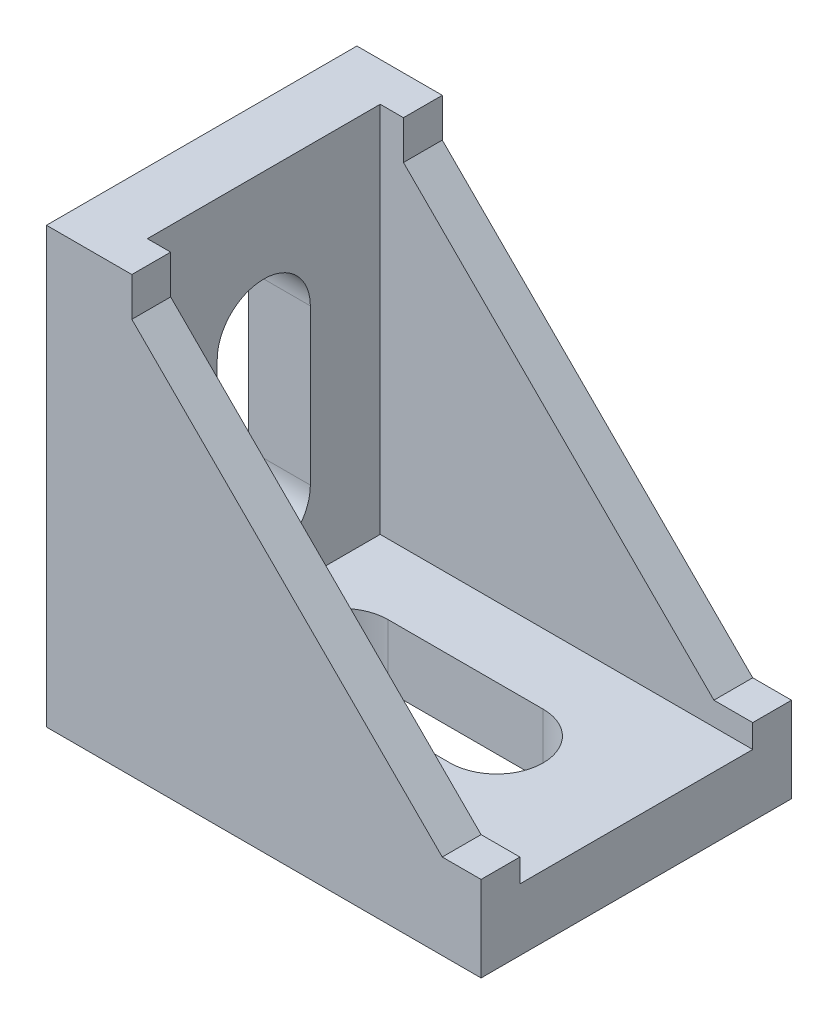
ISO-10303-21;
HEADER;
FILE_DESCRIPTION(('STEP AP214'),'2;1');
FILE_NAME('part.step','',(''),(''),'','','');
FILE_SCHEMA(('AUTOMOTIVE_DESIGN { 1 0 10303 214 1 1 1 1 }'));
ENDSEC;
DATA;
#1=APPLICATION_CONTEXT('core data for automotive mechanical design processes');
#2=APPLICATION_PROTOCOL_DEFINITION('international standard','automotive_design',2000,#1);
#3=PRODUCT_CONTEXT('',#1,'mechanical');
#4=PRODUCT('Part','Part','',(#3));
#5=PRODUCT_RELATED_PRODUCT_CATEGORY('part','',(#4));
#6=PRODUCT_DEFINITION_FORMATION('','',#4);
#7=PRODUCT_DEFINITION_CONTEXT('part definition',#1,'design');
#8=PRODUCT_DEFINITION('design','',#6,#7);
#9=PRODUCT_DEFINITION_SHAPE('','',#8);
#10=(LENGTH_UNIT() NAMED_UNIT(*) SI_UNIT(.MILLI.,.METRE.));
#11=(NAMED_UNIT(*) PLANE_ANGLE_UNIT() SI_UNIT($,.RADIAN.));
#12=(NAMED_UNIT(*) SI_UNIT($,.STERADIAN.) SOLID_ANGLE_UNIT());
#13=UNCERTAINTY_MEASURE_WITH_UNIT(LENGTH_MEASURE(1.E-05),#10,'distance_accuracy_value','');
#14=(GEOMETRIC_REPRESENTATION_CONTEXT(3) GLOBAL_UNCERTAINTY_ASSIGNED_CONTEXT((#13)) GLOBAL_UNIT_ASSIGNED_CONTEXT((#10,
#11,#12)) REPRESENTATION_CONTEXT('',''));
#15=CARTESIAN_POINT('',(0.,0.,0.));
#16=DIRECTION('',(0.,0.,1.));
#17=DIRECTION('',(1.,0.,0.));
#18=AXIS2_PLACEMENT_3D('',#15,#16,#17);
#19=CARTESIAN_POINT('',(0.,0.,20.));
#20=DIRECTION('',(0.,1.,0.));
#21=DIRECTION('',(0.,0.,1.));
#22=AXIS2_PLACEMENT_3D('',#19,#20,#21);
#23=PLANE('',#22);
#24=DIRECTION('',(1.,0.,0.));
#25=VECTOR('',#24,1.);
#26=CARTESIAN_POINT('',(0.,0.,0.));
#27=LINE('',#26,#25);
#28=CARTESIAN_POINT('',(0.,0.,0.));
#29=VERTEX_POINT('',#28);
#30=CARTESIAN_POINT('',(28.,0.,0.));
#31=VERTEX_POINT('',#30);
#32=EDGE_CURVE('E430',#29,#31,#27,.T.);
#33=ORIENTED_EDGE('',*,*,#32,.T.);
#34=DIRECTION('',(0.,0.,-1.));
#35=VECTOR('',#34,1.);
#36=CARTESIAN_POINT('',(28.,0.,20.));
#37=LINE('',#36,#35);
#38=CARTESIAN_POINT('',(28.,0.,20.));
#39=VERTEX_POINT('',#38);
#40=EDGE_CURVE('E438',#39,#31,#37,.T.);
#41=ORIENTED_EDGE('',*,*,#40,.F.);
#42=DIRECTION('',(1.,0.,0.));
#43=VECTOR('',#42,1.);
#44=CARTESIAN_POINT('',(0.,0.,20.));
#45=LINE('',#44,#43);
#46=CARTESIAN_POINT('',(0.,0.,20.));
#47=VERTEX_POINT('',#46);
#48=EDGE_CURVE('E419',#47,#39,#45,.T.);
#49=ORIENTED_EDGE('',*,*,#48,.F.);
#50=DIRECTION('',(0.,0.,-1.));
#51=VECTOR('',#50,1.);
#52=CARTESIAN_POINT('',(0.,0.,20.));
#53=LINE('',#52,#51);
#54=EDGE_CURVE('E441',#47,#29,#53,.T.);
#55=ORIENTED_EDGE('',*,*,#54,.T.);
#56=EDGE_LOOP('',(#33,#41,#49,#55));
#57=FACE_BOUND('',#56,.T.);
#58=DIRECTION('',(-1.,0.,0.));
#59=VECTOR('',#58,1.);
#60=CARTESIAN_POINT('',(19.,0.,13.));
#61=LINE('',#60,#59);
#62=CARTESIAN_POINT('',(19.,0.,13.));
#63=VERTEX_POINT('',#62);
#64=CARTESIAN_POINT('',(9.,0.,13.));
#65=VERTEX_POINT('',#64);
#66=EDGE_CURVE('E293',#63,#65,#61,.T.);
#67=ORIENTED_EDGE('',*,*,#66,.F.);
#68=CARTESIAN_POINT('',(19.,0.,10.));
#69=DIRECTION('',(0.,1.,0.));
#70=DIRECTION('',(0.,0.,1.));
#71=AXIS2_PLACEMENT_3D('',#68,#69,#70);
#72=CIRCLE('',#71,3.);
#73=CARTESIAN_POINT('',(19.,0.,7.));
#74=VERTEX_POINT('',#73);
#75=EDGE_CURVE('E296',#74,#63,#72,.F.);
#76=ORIENTED_EDGE('',*,*,#75,.F.);
#77=DIRECTION('',(1.,0.,0.));
#78=VECTOR('',#77,1.);
#79=CARTESIAN_POINT('',(9.,0.,7.));
#80=LINE('',#79,#78);
#81=CARTESIAN_POINT('',(9.,0.,7.));
#82=VERTEX_POINT('',#81);
#83=EDGE_CURVE('E298',#82,#74,#80,.T.);
#84=ORIENTED_EDGE('',*,*,#83,.F.);
#85=CARTESIAN_POINT('',(9.,0.,10.));
#86=DIRECTION('',(0.,1.,0.));
#87=DIRECTION('',(0.,0.,1.));
#88=AXIS2_PLACEMENT_3D('',#85,#86,#87);
#89=CIRCLE('',#88,3.);
#90=EDGE_CURVE('E290',#65,#82,#89,.F.);
#91=ORIENTED_EDGE('',*,*,#90,.F.);
#92=EDGE_LOOP('',(#67,#76,#84,#91));
#93=FACE_BOUND('',#92,.T.);
#94=DIRECTION('',(-1.,0.,0.));
#95=VECTOR('',#94,1.);
#96=CARTESIAN_POINT('',(27.,0.,12.9));
#97=LINE('',#96,#95);
#98=CARTESIAN_POINT('',(27.,0.,12.9));
#99=VERTEX_POINT('',#98);
#100=CARTESIAN_POINT('',(26.,0.,12.9));
#101=VERTEX_POINT('',#100);
#102=EDGE_CURVE('E250',#99,#101,#97,.T.);
#103=ORIENTED_EDGE('',*,*,#102,.F.);
#104=DIRECTION('',(0.,0.,1.));
#105=VECTOR('',#104,1.);
#106=CARTESIAN_POINT('',(27.,0.,12.9));
#107=LINE('',#106,#105);
#108=CARTESIAN_POINT('',(27.,0.,7.1));
#109=VERTEX_POINT('',#108);
#110=EDGE_CURVE('E247',#109,#99,#107,.T.);
#111=ORIENTED_EDGE('',*,*,#110,.F.);
#112=DIRECTION('',(1.,0.,0.));
#113=VECTOR('',#112,1.);
#114=CARTESIAN_POINT('',(27.,0.,7.1));
#115=LINE('',#114,#113);
#116=CARTESIAN_POINT('',(26.,0.,7.1));
#117=VERTEX_POINT('',#116);
#118=EDGE_CURVE('E54',#117,#109,#115,.T.);
#119=ORIENTED_EDGE('',*,*,#118,.F.);
#120=DIRECTION('',(0.,0.,-1.));
#121=VECTOR('',#120,1.);
#122=CARTESIAN_POINT('',(26.,0.,12.9));
#123=LINE('',#122,#121);
#124=EDGE_CURVE('E49',#101,#117,#123,.T.);
#125=ORIENTED_EDGE('',*,*,#124,.F.);
#126=EDGE_LOOP('',(#103,#111,#119,#125));
#127=FACE_BOUND('',#126,.T.);
#128=ADVANCED_FACE('F34',(#57,#93,#127),#23,.F.);
#129=CARTESIAN_POINT('',(0.,0.,20.));
#130=DIRECTION('',(1.,0.,0.));
#131=DIRECTION('',(0.,0.,-1.));
#132=AXIS2_PLACEMENT_3D('',#129,#130,#131);
#133=PLANE('',#132);
#134=DIRECTION('',(0.,-1.,0.));
#135=VECTOR('',#134,1.);
#136=CARTESIAN_POINT('',(0.,0.,0.));
#137=LINE('',#136,#135);
#138=CARTESIAN_POINT('',(0.,28.,0.));
#139=VERTEX_POINT('',#138);
#140=EDGE_CURVE('E415',#139,#29,#137,.T.);
#141=ORIENTED_EDGE('',*,*,#140,.T.);
#142=ORIENTED_EDGE('',*,*,#54,.F.);
#143=DIRECTION('',(0.,-1.,0.));
#144=VECTOR('',#143,1.);
#145=CARTESIAN_POINT('',(0.,0.,20.));
#146=LINE('',#145,#144);
#147=CARTESIAN_POINT('',(0.,28.,20.));
#148=VERTEX_POINT('',#147);
#149=EDGE_CURVE('E416',#148,#47,#146,.T.);
#150=ORIENTED_EDGE('',*,*,#149,.F.);
#151=DIRECTION('',(0.,0.,-1.));
#152=VECTOR('',#151,1.);
#153=CARTESIAN_POINT('',(0.,28.,20.));
#154=LINE('',#153,#152);
#155=EDGE_CURVE('E427',#148,#139,#154,.T.);
#156=ORIENTED_EDGE('',*,*,#155,.T.);
#157=EDGE_LOOP('',(#141,#142,#150,#156));
#158=FACE_BOUND('',#157,.T.);
#159=DIRECTION('',(0.,-1.,0.));
#160=VECTOR('',#159,1.);
#161=CARTESIAN_POINT('',(0.,19.,7.));
#162=LINE('',#161,#160);
#163=CARTESIAN_POINT('',(0.,19.,7.));
#164=VERTEX_POINT('',#163);
#165=CARTESIAN_POINT('',(0.,9.,7.));
#166=VERTEX_POINT('',#165);
#167=EDGE_CURVE('E322',#164,#166,#162,.T.);
#168=ORIENTED_EDGE('',*,*,#167,.F.);
#169=CARTESIAN_POINT('',(0.,19.,10.));
#170=DIRECTION('',(1.,0.,0.));
#171=DIRECTION('',(0.,0.,-1.));
#172=AXIS2_PLACEMENT_3D('',#169,#170,#171);
#173=CIRCLE('',#172,3.);
#174=CARTESIAN_POINT('',(0.,19.,13.));
#175=VERTEX_POINT('',#174);
#176=EDGE_CURVE('E325',#175,#164,#173,.F.);
#177=ORIENTED_EDGE('',*,*,#176,.F.);
#178=DIRECTION('',(0.,1.,0.));
#179=VECTOR('',#178,1.);
#180=CARTESIAN_POINT('',(0.,19.,13.));
#181=LINE('',#180,#179);
#182=CARTESIAN_POINT('',(0.,9.,13.));
#183=VERTEX_POINT('',#182);
#184=EDGE_CURVE('E327',#183,#175,#181,.T.);
#185=ORIENTED_EDGE('',*,*,#184,.F.);
#186=CARTESIAN_POINT('',(0.,9.,10.));
#187=DIRECTION('',(1.,0.,0.));
#188=DIRECTION('',(0.,0.,-1.));
#189=AXIS2_PLACEMENT_3D('',#186,#187,#188);
#190=CIRCLE('',#189,3.);
#191=EDGE_CURVE('E319',#166,#183,#190,.F.);
#192=ORIENTED_EDGE('',*,*,#191,.F.);
#193=EDGE_LOOP('',(#168,#177,#185,#192));
#194=FACE_BOUND('',#193,.T.);
#195=DIRECTION('',(0.,-1.,0.));
#196=VECTOR('',#195,1.);
#197=CARTESIAN_POINT('',(0.,27.,7.1));
#198=LINE('',#197,#196);
#199=CARTESIAN_POINT('',(0.,27.,7.1));
#200=VERTEX_POINT('',#199);
#201=CARTESIAN_POINT('',(0.,26.,7.1));
#202=VERTEX_POINT('',#201);
#203=EDGE_CURVE('E251',#200,#202,#198,.T.);
#204=ORIENTED_EDGE('',*,*,#203,.F.);
#205=DIRECTION('',(0.,0.,-1.));
#206=VECTOR('',#205,1.);
#207=CARTESIAN_POINT('',(0.,27.,12.9));
#208=LINE('',#207,#206);
#209=CARTESIAN_POINT('',(0.,27.,12.9));
#210=VERTEX_POINT('',#209);
#211=EDGE_CURVE('E264',#210,#200,#208,.T.);
#212=ORIENTED_EDGE('',*,*,#211,.F.);
#213=DIRECTION('',(0.,1.,0.));
#214=VECTOR('',#213,1.);
#215=CARTESIAN_POINT('',(0.,27.,12.9));
#216=LINE('',#215,#214);
#217=CARTESIAN_POINT('',(0.,26.,12.9));
#218=VERTEX_POINT('',#217);
#219=EDGE_CURVE('E273',#218,#210,#216,.T.);
#220=ORIENTED_EDGE('',*,*,#219,.F.);
#221=DIRECTION('',(0.,0.,1.));
#222=VECTOR('',#221,1.);
#223=CARTESIAN_POINT('',(0.,26.,12.9));
#224=LINE('',#223,#222);
#225=EDGE_CURVE('E254',#202,#218,#224,.T.);
#226=ORIENTED_EDGE('',*,*,#225,.F.);
#227=EDGE_LOOP('',(#204,#212,#220,#226));
#228=FACE_BOUND('',#227,.T.);
#229=ADVANCED_FACE('F36',(#158,#194,#228),#133,.F.);
#230=CARTESIAN_POINT('',(5.5,29.4261426220374,0.));
#231=DIRECTION('',(-1.,0.,0.));
#232=DIRECTION('',(0.,0.,1.));
#233=AXIS2_PLACEMENT_3D('',#230,#231,#232);
#234=PLANE('',#233);
#235=DIRECTION('',(0.,0.,1.));
#236=VECTOR('',#235,1.);
#237=CARTESIAN_POINT('',(5.5,25.5,0.));
#238=LINE('',#237,#236);
#239=CARTESIAN_POINT('',(5.5,25.5,17.5));
#240=VERTEX_POINT('',#239);
#241=CARTESIAN_POINT('',(5.5,25.5,20.));
#242=VERTEX_POINT('',#241);
#243=EDGE_CURVE('E404',#240,#242,#238,.T.);
#244=ORIENTED_EDGE('',*,*,#243,.F.);
#245=DIRECTION('',(0.,1.,0.));
#246=VECTOR('',#245,1.);
#247=CARTESIAN_POINT('',(5.5,29.4261426220374,17.5));
#248=LINE('',#247,#246);
#249=CARTESIAN_POINT('',(5.5,28.,17.5));
#250=VERTEX_POINT('',#249);
#251=EDGE_CURVE('E378',#240,#250,#248,.T.);
#252=ORIENTED_EDGE('',*,*,#251,.T.);
#253=DIRECTION('',(0.,0.,-1.));
#254=VECTOR('',#253,1.);
#255=CARTESIAN_POINT('',(5.5,28.,20.));
#256=LINE('',#255,#254);
#257=CARTESIAN_POINT('',(5.5,28.,20.));
#258=VERTEX_POINT('',#257);
#259=EDGE_CURVE('E412',#258,#250,#256,.T.);
#260=ORIENTED_EDGE('',*,*,#259,.F.);
#261=DIRECTION('',(0.,-1.,0.));
#262=VECTOR('',#261,1.);
#263=CARTESIAN_POINT('',(5.5,29.4261426220374,20.));
#264=LINE('',#263,#262);
#265=EDGE_CURVE('E389',#258,#242,#264,.T.);
#266=ORIENTED_EDGE('',*,*,#265,.T.);
#267=EDGE_LOOP('',(#244,#252,#260,#266));
#268=FACE_BOUND('',#267,.T.);
#269=ADVANCED_FACE('F456',(#268),#234,.F.);
#270=CARTESIAN_POINT('',(25.5,5.5,0.));
#271=DIRECTION('',(0.,-1.,0.));
#272=DIRECTION('',(1.,0.,0.));
#273=AXIS2_PLACEMENT_3D('',#270,#271,#272);
#274=PLANE('',#273);
#275=DIRECTION('',(0.,0.,1.));
#276=VECTOR('',#275,1.);
#277=CARTESIAN_POINT('',(28.,5.5,20.));
#278=LINE('',#277,#276);
#279=CARTESIAN_POINT('',(28.,5.5,17.5));
#280=VERTEX_POINT('',#279);
#281=CARTESIAN_POINT('',(28.,5.5,20.));
#282=VERTEX_POINT('',#281);
#283=EDGE_CURVE('E403',#280,#282,#278,.T.);
#284=ORIENTED_EDGE('',*,*,#283,.F.);
#285=DIRECTION('',(-1.,0.,0.));
#286=VECTOR('',#285,1.);
#287=CARTESIAN_POINT('',(25.5,5.5,17.5));
#288=LINE('',#287,#286);
#289=CARTESIAN_POINT('',(25.5,5.5,17.5));
#290=VERTEX_POINT('',#289);
#291=EDGE_CURVE('E375',#280,#290,#288,.T.);
#292=ORIENTED_EDGE('',*,*,#291,.T.);
#293=DIRECTION('',(0.,0.,1.));
#294=VECTOR('',#293,1.);
#295=CARTESIAN_POINT('',(25.5,5.5,0.));
#296=LINE('',#295,#294);
#297=CARTESIAN_POINT('',(25.5,5.5,20.));
#298=VERTEX_POINT('',#297);
#299=EDGE_CURVE('E392',#290,#298,#296,.T.);
#300=ORIENTED_EDGE('',*,*,#299,.T.);
#301=DIRECTION('',(1.,0.,0.));
#302=VECTOR('',#301,1.);
#303=CARTESIAN_POINT('',(25.5,5.5,20.));
#304=LINE('',#303,#302);
#305=EDGE_CURVE('E395',#298,#282,#304,.T.);
#306=ORIENTED_EDGE('',*,*,#305,.T.);
#307=EDGE_LOOP('',(#284,#292,#300,#306));
#308=FACE_BOUND('',#307,.T.);
#309=ADVANCED_FACE('F466',(#308),#274,.F.);
#310=CARTESIAN_POINT('',(5.5,25.5,0.));
#311=DIRECTION('',(-0.707106781186548,-0.707106781186548,0.));
#312=DIRECTION('',(0.707106781186548,-0.707106781186548,0.));
#313=AXIS2_PLACEMENT_3D('',#310,#311,#312);
#314=PLANE('',#313);
#315=ORIENTED_EDGE('',*,*,#299,.F.);
#316=DIRECTION('',(-0.707106781186548,0.707106781186548,0.));
#317=VECTOR('',#316,1.);
#318=CARTESIAN_POINT('',(5.5,25.5,17.5));
#319=LINE('',#318,#317);
#320=EDGE_CURVE('E42',#290,#240,#319,.T.);
#321=ORIENTED_EDGE('',*,*,#320,.T.);
#322=ORIENTED_EDGE('',*,*,#243,.T.);
#323=DIRECTION('',(0.707106781186548,-0.707106781186548,0.));
#324=VECTOR('',#323,1.);
#325=CARTESIAN_POINT('',(5.5,25.5,20.));
#326=LINE('',#325,#324);
#327=EDGE_CURVE('E384',#242,#298,#326,.T.);
#328=ORIENTED_EDGE('',*,*,#327,.T.);
#329=EDGE_LOOP('',(#315,#321,#322,#328));
#330=FACE_BOUND('',#329,.T.);
#331=ADVANCED_FACE('F453',(#330),#314,.F.);
#332=CARTESIAN_POINT('',(28.,0.,20.));
#333=DIRECTION('',(-1.,0.,0.));
#334=DIRECTION('',(0.,0.,1.));
#335=AXIS2_PLACEMENT_3D('',#332,#333,#334);
#336=PLANE('',#335);
#337=DIRECTION('',(0.,0.,-1.));
#338=VECTOR('',#337,1.);
#339=CARTESIAN_POINT('',(28.,4.,17.5));
#340=LINE('',#339,#338);
#341=CARTESIAN_POINT('',(28.,4.,17.5));
#342=VERTEX_POINT('',#341);
#343=CARTESIAN_POINT('',(28.,4.,2.5));
#344=VERTEX_POINT('',#343);
#345=EDGE_CURVE('E350',#342,#344,#340,.T.);
#346=ORIENTED_EDGE('',*,*,#345,.F.);
#347=DIRECTION('',(0.,-1.,0.));
#348=VECTOR('',#347,1.);
#349=CARTESIAN_POINT('',(28.,30.8809496041156,17.5));
#350=LINE('',#349,#348);
#351=EDGE_CURVE('E353',#280,#342,#350,.T.);
#352=ORIENTED_EDGE('',*,*,#351,.F.);
#353=ORIENTED_EDGE('',*,*,#283,.T.);
#354=DIRECTION('',(0.,1.,0.));
#355=VECTOR('',#354,1.);
#356=CARTESIAN_POINT('',(28.,0.,20.));
#357=LINE('',#356,#355);
#358=EDGE_CURVE('E422',#39,#282,#357,.T.);
#359=ORIENTED_EDGE('',*,*,#358,.F.);
#360=ORIENTED_EDGE('',*,*,#40,.T.);
#361=DIRECTION('',(0.,1.,0.));
#362=VECTOR('',#361,1.);
#363=CARTESIAN_POINT('',(28.,0.,0.));
#364=LINE('',#363,#362);
#365=CARTESIAN_POINT('',(28.,5.5,0.));
#366=VERTEX_POINT('',#365);
#367=EDGE_CURVE('E432',#31,#366,#364,.T.);
#368=ORIENTED_EDGE('',*,*,#367,.T.);
#369=CARTESIAN_POINT('',(28.,5.5,2.5));
#370=VERTEX_POINT('',#369);
#371=EDGE_CURVE('E408',#366,#370,#278,.T.);
#372=ORIENTED_EDGE('',*,*,#371,.T.);
#373=DIRECTION('',(0.,1.,0.));
#374=VECTOR('',#373,1.);
#375=CARTESIAN_POINT('',(28.,30.8809496041156,2.5));
#376=LINE('',#375,#374);
#377=EDGE_CURVE('E348',#344,#370,#376,.T.);
#378=ORIENTED_EDGE('',*,*,#377,.F.);
#379=EDGE_LOOP('',(#346,#352,#353,#359,#360,#368,#372,#378));
#380=FACE_BOUND('',#379,.T.);
#381=ADVANCED_FACE('F472',(#380),#336,.F.);
#382=CARTESIAN_POINT('',(0.,28.,20.));
#383=DIRECTION('',(0.,-1.,0.));
#384=DIRECTION('',(0.,0.,-1.));
#385=AXIS2_PLACEMENT_3D('',#382,#383,#384);
#386=PLANE('',#385);
#387=ORIENTED_EDGE('',*,*,#259,.T.);
#388=DIRECTION('',(-1.,0.,0.));
#389=VECTOR('',#388,1.);
#390=CARTESIAN_POINT('',(0.,28.,17.5));
#391=LINE('',#390,#389);
#392=CARTESIAN_POINT('',(4.,28.,17.5));
#393=VERTEX_POINT('',#392);
#394=EDGE_CURVE('E381',#250,#393,#391,.T.);
#395=ORIENTED_EDGE('',*,*,#394,.T.);
#396=DIRECTION('',(0.,0.,1.));
#397=VECTOR('',#396,1.);
#398=CARTESIAN_POINT('',(4.,28.,20.));
#399=LINE('',#398,#397);
#400=CARTESIAN_POINT('',(4.,28.,2.5));
#401=VERTEX_POINT('',#400);
#402=EDGE_CURVE('E11',#401,#393,#399,.T.);
#403=ORIENTED_EDGE('',*,*,#402,.F.);
#404=DIRECTION('',(1.,0.,0.));
#405=VECTOR('',#404,1.);
#406=CARTESIAN_POINT('',(0.,28.,2.5));
#407=LINE('',#406,#405);
#408=CARTESIAN_POINT('',(5.5,28.,2.5));
#409=VERTEX_POINT('',#408);
#410=EDGE_CURVE('E372',#401,#409,#407,.T.);
#411=ORIENTED_EDGE('',*,*,#410,.T.);
#412=CARTESIAN_POINT('',(5.5,28.,0.));
#413=VERTEX_POINT('',#412);
#414=EDGE_CURVE('E411',#409,#413,#256,.T.);
#415=ORIENTED_EDGE('',*,*,#414,.T.);
#416=DIRECTION('',(-1.,0.,0.));
#417=VECTOR('',#416,1.);
#418=CARTESIAN_POINT('',(0.,28.,0.));
#419=LINE('',#418,#417);
#420=EDGE_CURVE('E420',#413,#139,#419,.T.);
#421=ORIENTED_EDGE('',*,*,#420,.T.);
#422=ORIENTED_EDGE('',*,*,#155,.F.);
#423=DIRECTION('',(-1.,0.,0.));
#424=VECTOR('',#423,1.);
#425=CARTESIAN_POINT('',(0.,28.,20.));
#426=LINE('',#425,#424);
#427=EDGE_CURVE('E425',#258,#148,#426,.T.);
#428=ORIENTED_EDGE('',*,*,#427,.F.);
#429=EDGE_LOOP('',(#387,#395,#403,#411,#415,#421,#422,#428));
#430=FACE_BOUND('',#429,.T.);
#431=ADVANCED_FACE('F486',(#430),#386,.F.);
#432=CARTESIAN_POINT('',(0.,0.,20.));
#433=DIRECTION('',(0.,0.,-1.));
#434=DIRECTION('',(-1.,0.,0.));
#435=AXIS2_PLACEMENT_3D('',#432,#433,#434);
#436=PLANE('',#435);
#437=ORIENTED_EDGE('',*,*,#327,.F.);
#438=ORIENTED_EDGE('',*,*,#265,.F.);
#439=ORIENTED_EDGE('',*,*,#427,.T.);
#440=ORIENTED_EDGE('',*,*,#149,.T.);
#441=ORIENTED_EDGE('',*,*,#48,.T.);
#442=ORIENTED_EDGE('',*,*,#358,.T.);
#443=ORIENTED_EDGE('',*,*,#305,.F.);
#444=EDGE_LOOP('',(#437,#438,#439,#440,#441,#442,#443));
#445=FACE_BOUND('',#444,.T.);
#446=ADVANCED_FACE('F462',(#445),#436,.F.);
#447=CARTESIAN_POINT('',(0.,0.,0.));
#448=DIRECTION('',(0.,0.,-1.));
#449=DIRECTION('',(-1.,0.,0.));
#450=AXIS2_PLACEMENT_3D('',#447,#448,#449);
#451=PLANE('',#450);
#452=DIRECTION('',(0.,1.,0.));
#453=VECTOR('',#452,1.);
#454=CARTESIAN_POINT('',(5.5,0.,0.));
#455=LINE('',#454,#453);
#456=CARTESIAN_POINT('',(5.5,25.5,0.));
#457=VERTEX_POINT('',#456);
#458=EDGE_CURVE('E444',#457,#413,#455,.T.);
#459=ORIENTED_EDGE('',*,*,#458,.F.);
#460=DIRECTION('',(0.707106781186548,-0.707106781186548,0.));
#461=VECTOR('',#460,1.);
#462=CARTESIAN_POINT('',(5.5,25.5,0.));
#463=LINE('',#462,#461);
#464=CARTESIAN_POINT('',(25.5,5.5,0.));
#465=VERTEX_POINT('',#464);
#466=EDGE_CURVE('E385',#457,#465,#463,.T.);
#467=ORIENTED_EDGE('',*,*,#466,.T.);
#468=DIRECTION('',(1.,0.,0.));
#469=VECTOR('',#468,1.);
#470=CARTESIAN_POINT('',(25.5,5.5,0.));
#471=LINE('',#470,#469);
#472=EDGE_CURVE('E388',#465,#366,#471,.T.);
#473=ORIENTED_EDGE('',*,*,#472,.T.);
#474=ORIENTED_EDGE('',*,*,#367,.F.);
#475=ORIENTED_EDGE('',*,*,#32,.F.);
#476=ORIENTED_EDGE('',*,*,#140,.F.);
#477=ORIENTED_EDGE('',*,*,#420,.F.);
#478=EDGE_LOOP('',(#459,#467,#473,#474,#475,#476,#477));
#479=FACE_BOUND('',#478,.T.);
#480=ADVANCED_FACE('F500',(#479),#451,.T.);
#481=ORIENTED_EDGE('',*,*,#414,.F.);
#482=DIRECTION('',(0.,-1.,0.));
#483=VECTOR('',#482,1.);
#484=CARTESIAN_POINT('',(5.5,29.4261426220374,2.5));
#485=LINE('',#484,#483);
#486=CARTESIAN_POINT('',(5.5,25.5,2.5));
#487=VERTEX_POINT('',#486);
#488=EDGE_CURVE('E369',#409,#487,#485,.T.);
#489=ORIENTED_EDGE('',*,*,#488,.T.);
#490=EDGE_CURVE('E400',#457,#487,#238,.T.);
#491=ORIENTED_EDGE('',*,*,#490,.F.);
#492=ORIENTED_EDGE('',*,*,#458,.T.);
#493=EDGE_LOOP('',(#481,#489,#491,#492));
#494=FACE_BOUND('',#493,.T.);
#495=ADVANCED_FACE('F508',(#494),#234,.F.);
#496=CARTESIAN_POINT('',(25.5,5.5,2.5));
#497=VERTEX_POINT('',#496);
#498=EDGE_CURVE('E405',#465,#497,#296,.T.);
#499=ORIENTED_EDGE('',*,*,#498,.T.);
#500=DIRECTION('',(1.,0.,0.));
#501=VECTOR('',#500,1.);
#502=CARTESIAN_POINT('',(25.5,5.5,2.5));
#503=LINE('',#502,#501);
#504=EDGE_CURVE('E355',#497,#370,#503,.T.);
#505=ORIENTED_EDGE('',*,*,#504,.T.);
#506=ORIENTED_EDGE('',*,*,#371,.F.);
#507=ORIENTED_EDGE('',*,*,#472,.F.);
#508=EDGE_LOOP('',(#499,#505,#506,#507));
#509=FACE_BOUND('',#508,.T.);
#510=ADVANCED_FACE('F504',(#509),#274,.F.);
#511=ORIENTED_EDGE('',*,*,#490,.T.);
#512=DIRECTION('',(0.707106781186548,-0.707106781186548,0.));
#513=VECTOR('',#512,1.);
#514=CARTESIAN_POINT('',(5.5,25.5,2.5));
#515=LINE('',#514,#513);
#516=EDGE_CURVE('E447',#487,#497,#515,.T.);
#517=ORIENTED_EDGE('',*,*,#516,.T.);
#518=ORIENTED_EDGE('',*,*,#498,.F.);
#519=ORIENTED_EDGE('',*,*,#466,.F.);
#520=EDGE_LOOP('',(#511,#517,#518,#519));
#521=FACE_BOUND('',#520,.T.);
#522=ADVANCED_FACE('F506',(#521),#314,.F.);
#523=CARTESIAN_POINT('',(4.,0.,0.));
#524=DIRECTION('',(1.,0.,0.));
#525=DIRECTION('',(0.,0.,-1.));
#526=AXIS2_PLACEMENT_3D('',#523,#524,#525);
#527=PLANE('',#526);
#528=CARTESIAN_POINT('',(4.,19.,10.));
#529=DIRECTION('',(1.,0.,0.));
#530=DIRECTION('',(0.,0.,-1.));
#531=AXIS2_PLACEMENT_3D('',#528,#529,#530);
#532=CIRCLE('',#531,3.);
#533=CARTESIAN_POINT('',(4.,19.,7.));
#534=VERTEX_POINT('',#533);
#535=CARTESIAN_POINT('',(4.,19.,13.));
#536=VERTEX_POINT('',#535);
#537=EDGE_CURVE('E318',#534,#536,#532,.T.);
#538=ORIENTED_EDGE('',*,*,#537,.F.);
#539=DIRECTION('',(0.,1.,0.));
#540=VECTOR('',#539,1.);
#541=CARTESIAN_POINT('',(4.,19.,7.));
#542=LINE('',#541,#540);
#543=CARTESIAN_POINT('',(4.,9.,7.));
#544=VERTEX_POINT('',#543);
#545=EDGE_CURVE('E335',#544,#534,#542,.T.);
#546=ORIENTED_EDGE('',*,*,#545,.F.);
#547=CARTESIAN_POINT('',(4.,9.,10.));
#548=DIRECTION('',(1.,0.,0.));
#549=DIRECTION('',(0.,0.,-1.));
#550=AXIS2_PLACEMENT_3D('',#547,#548,#549);
#551=CIRCLE('',#550,3.);
#552=CARTESIAN_POINT('',(4.,9.,13.));
#553=VERTEX_POINT('',#552);
#554=EDGE_CURVE('E332',#553,#544,#551,.T.);
#555=ORIENTED_EDGE('',*,*,#554,.F.);
#556=DIRECTION('',(0.,-1.,0.));
#557=VECTOR('',#556,1.);
#558=CARTESIAN_POINT('',(4.,19.,13.));
#559=LINE('',#558,#557);
#560=EDGE_CURVE('E329',#536,#553,#559,.T.);
#561=ORIENTED_EDGE('',*,*,#560,.F.);
#562=EDGE_LOOP('',(#538,#546,#555,#561));
#563=FACE_BOUND('',#562,.T.);
#564=ORIENTED_EDGE('',*,*,#402,.T.);
#565=DIRECTION('',(0.,1.,0.));
#566=VECTOR('',#565,1.);
#567=CARTESIAN_POINT('',(4.,30.8809496041156,17.5));
#568=LINE('',#567,#566);
#569=CARTESIAN_POINT('',(4.,4.,17.5));
#570=VERTEX_POINT('',#569);
#571=EDGE_CURVE('E347',#570,#393,#568,.T.);
#572=ORIENTED_EDGE('',*,*,#571,.F.);
#573=DIRECTION('',(0.,0.,1.));
#574=VECTOR('',#573,1.);
#575=CARTESIAN_POINT('',(4.,4.,17.5));
#576=LINE('',#575,#574);
#577=CARTESIAN_POINT('',(4.,4.,2.5));
#578=VERTEX_POINT('',#577);
#579=EDGE_CURVE('E360',#578,#570,#576,.T.);
#580=ORIENTED_EDGE('',*,*,#579,.F.);
#581=DIRECTION('',(0.,-1.,0.));
#582=VECTOR('',#581,1.);
#583=CARTESIAN_POINT('',(4.,30.8809496041156,2.5));
#584=LINE('',#583,#582);
#585=EDGE_CURVE('E358',#401,#578,#584,.T.);
#586=ORIENTED_EDGE('',*,*,#585,.F.);
#587=EDGE_LOOP('',(#564,#572,#580,#586));
#588=FACE_BOUND('',#587,.T.);
#589=ADVANCED_FACE('F483',(#563,#588),#527,.T.);
#590=CARTESIAN_POINT('',(58.782875947822,30.8809496041156,17.5));
#591=DIRECTION('',(0.,0.,1.));
#592=DIRECTION('',(1.,0.,0.));
#593=AXIS2_PLACEMENT_3D('',#590,#591,#592);
#594=PLANE('',#593);
#595=ORIENTED_EDGE('',*,*,#251,.F.);
#596=ORIENTED_EDGE('',*,*,#320,.F.);
#597=ORIENTED_EDGE('',*,*,#291,.F.);
#598=ORIENTED_EDGE('',*,*,#351,.T.);
#599=DIRECTION('',(-1.,0.,0.));
#600=VECTOR('',#599,1.);
#601=CARTESIAN_POINT('',(58.782875947822,4.,17.5));
#602=LINE('',#601,#600);
#603=EDGE_CURVE('E351',#342,#570,#602,.T.);
#604=ORIENTED_EDGE('',*,*,#603,.T.);
#605=ORIENTED_EDGE('',*,*,#571,.T.);
#606=ORIENTED_EDGE('',*,*,#394,.F.);
#607=EDGE_LOOP('',(#595,#596,#597,#598,#604,#605,#606));
#608=FACE_BOUND('',#607,.T.);
#609=ADVANCED_FACE('F468',(#608),#594,.F.);
#610=CARTESIAN_POINT('',(58.782875947822,30.8809496041156,2.5));
#611=DIRECTION('',(0.,0.,-1.));
#612=DIRECTION('',(-1.,0.,0.));
#613=AXIS2_PLACEMENT_3D('',#610,#611,#612);
#614=PLANE('',#613);
#615=ORIENTED_EDGE('',*,*,#585,.T.);
#616=DIRECTION('',(-1.,0.,0.));
#617=VECTOR('',#616,1.);
#618=CARTESIAN_POINT('',(58.782875947822,4.,2.5));
#619=LINE('',#618,#617);
#620=EDGE_CURVE('E363',#344,#578,#619,.T.);
#621=ORIENTED_EDGE('',*,*,#620,.F.);
#622=ORIENTED_EDGE('',*,*,#377,.T.);
#623=ORIENTED_EDGE('',*,*,#504,.F.);
#624=ORIENTED_EDGE('',*,*,#516,.F.);
#625=ORIENTED_EDGE('',*,*,#488,.F.);
#626=ORIENTED_EDGE('',*,*,#410,.F.);
#627=EDGE_LOOP('',(#615,#621,#622,#623,#624,#625,#626));
#628=FACE_BOUND('',#627,.T.);
#629=ADVANCED_FACE('F479',(#628),#614,.F.);
#630=CARTESIAN_POINT('',(58.782875947822,4.,17.5));
#631=DIRECTION('',(0.,-1.,0.));
#632=DIRECTION('',(0.,0.,-1.));
#633=AXIS2_PLACEMENT_3D('',#630,#631,#632);
#634=PLANE('',#633);
#635=DIRECTION('',(-1.,0.,0.));
#636=VECTOR('',#635,1.);
#637=CARTESIAN_POINT('',(9.,4.,7.));
#638=LINE('',#637,#636);
#639=CARTESIAN_POINT('',(19.,4.,7.));
#640=VERTEX_POINT('',#639);
#641=CARTESIAN_POINT('',(9.,4.,7.));
#642=VERTEX_POINT('',#641);
#643=EDGE_CURVE('E300',#640,#642,#638,.T.);
#644=ORIENTED_EDGE('',*,*,#643,.F.);
#645=CARTESIAN_POINT('',(19.,4.,10.));
#646=DIRECTION('',(0.,1.,0.));
#647=DIRECTION('',(0.,0.,1.));
#648=AXIS2_PLACEMENT_3D('',#645,#646,#647);
#649=CIRCLE('',#648,3.);
#650=CARTESIAN_POINT('',(19.,4.,13.));
#651=VERTEX_POINT('',#650);
#652=EDGE_CURVE('E289',#651,#640,#649,.T.);
#653=ORIENTED_EDGE('',*,*,#652,.F.);
#654=DIRECTION('',(1.,0.,0.));
#655=VECTOR('',#654,1.);
#656=CARTESIAN_POINT('',(19.,4.,13.));
#657=LINE('',#656,#655);
#658=CARTESIAN_POINT('',(9.,4.,13.));
#659=VERTEX_POINT('',#658);
#660=EDGE_CURVE('E306',#659,#651,#657,.T.);
#661=ORIENTED_EDGE('',*,*,#660,.F.);
#662=CARTESIAN_POINT('',(9.,4.,10.));
#663=DIRECTION('',(0.,1.,0.));
#664=DIRECTION('',(0.,0.,1.));
#665=AXIS2_PLACEMENT_3D('',#662,#663,#664);
#666=CIRCLE('',#665,3.);
#667=EDGE_CURVE('E303',#642,#659,#666,.T.);
#668=ORIENTED_EDGE('',*,*,#667,.F.);
#669=EDGE_LOOP('',(#644,#653,#661,#668));
#670=FACE_BOUND('',#669,.T.);
#671=ORIENTED_EDGE('',*,*,#345,.T.);
#672=ORIENTED_EDGE('',*,*,#620,.T.);
#673=ORIENTED_EDGE('',*,*,#579,.T.);
#674=ORIENTED_EDGE('',*,*,#603,.F.);
#675=EDGE_LOOP('',(#671,#672,#673,#674));
#676=FACE_BOUND('',#675,.T.);
#677=ADVANCED_FACE('F476',(#670,#676),#634,.F.);
#678=CARTESIAN_POINT('',(-17.0880074906351,19.,10.));
#679=DIRECTION('',(1.,0.,0.));
#680=DIRECTION('',(0.,0.,-1.));
#681=AXIS2_PLACEMENT_3D('',#678,#679,#680);
#682=CYLINDRICAL_SURFACE('',#681,3.);
#683=ORIENTED_EDGE('',*,*,#176,.T.);
#684=DIRECTION('',(1.,0.,0.));
#685=VECTOR('',#684,1.);
#686=CARTESIAN_POINT('',(-17.0880074906351,19.,7.));
#687=LINE('',#686,#685);
#688=EDGE_CURVE('E323',#164,#534,#687,.T.);
#689=ORIENTED_EDGE('',*,*,#688,.T.);
#690=ORIENTED_EDGE('',*,*,#537,.T.);
#691=DIRECTION('',(1.,0.,0.));
#692=VECTOR('',#691,1.);
#693=CARTESIAN_POINT('',(-17.0880074906351,19.,13.));
#694=LINE('',#693,#692);
#695=EDGE_CURVE('E338',#175,#536,#694,.T.);
#696=ORIENTED_EDGE('',*,*,#695,.F.);
#697=EDGE_LOOP('',(#683,#689,#690,#696));
#698=FACE_BOUND('',#697,.T.);
#699=ADVANCED_FACE('F680',(#698),#682,.F.);
#700=CARTESIAN_POINT('',(-17.0880074906351,19.,7.));
#701=DIRECTION('',(0.,0.,-1.));
#702=DIRECTION('',(0.,1.,0.));
#703=AXIS2_PLACEMENT_3D('',#700,#701,#702);
#704=PLANE('',#703);
#705=ORIENTED_EDGE('',*,*,#167,.T.);
#706=DIRECTION('',(1.,0.,0.));
#707=VECTOR('',#706,1.);
#708=CARTESIAN_POINT('',(-17.0880074906351,9.,7.));
#709=LINE('',#708,#707);
#710=EDGE_CURVE('E340',#166,#544,#709,.T.);
#711=ORIENTED_EDGE('',*,*,#710,.T.);
#712=ORIENTED_EDGE('',*,*,#545,.T.);
#713=ORIENTED_EDGE('',*,*,#688,.F.);
#714=EDGE_LOOP('',(#705,#711,#712,#713));
#715=FACE_BOUND('',#714,.T.);
#716=ADVANCED_FACE('F676',(#715),#704,.F.);
#717=CARTESIAN_POINT('',(-17.0880074906351,9.,10.));
#718=DIRECTION('',(1.,0.,0.));
#719=DIRECTION('',(0.,0.,-1.));
#720=AXIS2_PLACEMENT_3D('',#717,#718,#719);
#721=CYLINDRICAL_SURFACE('',#720,3.);
#722=ORIENTED_EDGE('',*,*,#191,.T.);
#723=DIRECTION('',(1.,0.,0.));
#724=VECTOR('',#723,1.);
#725=CARTESIAN_POINT('',(-17.0880074906351,9.,13.));
#726=LINE('',#725,#724);
#727=EDGE_CURVE('E342',#183,#553,#726,.T.);
#728=ORIENTED_EDGE('',*,*,#727,.T.);
#729=ORIENTED_EDGE('',*,*,#554,.T.);
#730=ORIENTED_EDGE('',*,*,#710,.F.);
#731=EDGE_LOOP('',(#722,#728,#729,#730));
#732=FACE_BOUND('',#731,.T.);
#733=ADVANCED_FACE('F679',(#732),#721,.F.);
#734=CARTESIAN_POINT('',(-17.0880074906351,19.,13.));
#735=DIRECTION('',(0.,0.,1.));
#736=DIRECTION('',(1.,0.,0.));
#737=AXIS2_PLACEMENT_3D('',#734,#735,#736);
#738=PLANE('',#737);
#739=ORIENTED_EDGE('',*,*,#184,.T.);
#740=ORIENTED_EDGE('',*,*,#695,.T.);
#741=ORIENTED_EDGE('',*,*,#560,.T.);
#742=ORIENTED_EDGE('',*,*,#727,.F.);
#743=EDGE_LOOP('',(#739,#740,#741,#742));
#744=FACE_BOUND('',#743,.T.);
#745=ADVANCED_FACE('F674',(#744),#738,.F.);
#746=CARTESIAN_POINT('',(19.,-17.0880074906351,10.));
#747=DIRECTION('',(0.,1.,0.));
#748=DIRECTION('',(0.,0.,1.));
#749=AXIS2_PLACEMENT_3D('',#746,#747,#748);
#750=CYLINDRICAL_SURFACE('',#749,3.);
#751=ORIENTED_EDGE('',*,*,#75,.T.);
#752=DIRECTION('',(0.,1.,0.));
#753=VECTOR('',#752,1.);
#754=CARTESIAN_POINT('',(19.,-17.0880074906351,13.));
#755=LINE('',#754,#753);
#756=EDGE_CURVE('E294',#63,#651,#755,.T.);
#757=ORIENTED_EDGE('',*,*,#756,.T.);
#758=ORIENTED_EDGE('',*,*,#652,.T.);
#759=DIRECTION('',(0.,1.,0.));
#760=VECTOR('',#759,1.);
#761=CARTESIAN_POINT('',(19.,-17.0880074906351,7.));
#762=LINE('',#761,#760);
#763=EDGE_CURVE('E309',#74,#640,#762,.T.);
#764=ORIENTED_EDGE('',*,*,#763,.F.);
#765=EDGE_LOOP('',(#751,#757,#758,#764));
#766=FACE_BOUND('',#765,.T.);
#767=ADVANCED_FACE('F665',(#766),#750,.F.);
#768=CARTESIAN_POINT('',(19.,-17.0880074906351,13.));
#769=DIRECTION('',(0.,0.,1.));
#770=DIRECTION('',(1.,0.,0.));
#771=AXIS2_PLACEMENT_3D('',#768,#769,#770);
#772=PLANE('',#771);
#773=ORIENTED_EDGE('',*,*,#66,.T.);
#774=DIRECTION('',(0.,1.,0.));
#775=VECTOR('',#774,1.);
#776=CARTESIAN_POINT('',(9.,-17.0880074906351,13.));
#777=LINE('',#776,#775);
#778=EDGE_CURVE('E311',#65,#659,#777,.T.);
#779=ORIENTED_EDGE('',*,*,#778,.T.);
#780=ORIENTED_EDGE('',*,*,#660,.T.);
#781=ORIENTED_EDGE('',*,*,#756,.F.);
#782=EDGE_LOOP('',(#773,#779,#780,#781));
#783=FACE_BOUND('',#782,.T.);
#784=ADVANCED_FACE('F661',(#783),#772,.F.);
#785=CARTESIAN_POINT('',(9.,-17.0880074906351,10.));
#786=DIRECTION('',(0.,1.,0.));
#787=DIRECTION('',(0.,0.,1.));
#788=AXIS2_PLACEMENT_3D('',#785,#786,#787);
#789=CYLINDRICAL_SURFACE('',#788,3.);
#790=ORIENTED_EDGE('',*,*,#90,.T.);
#791=DIRECTION('',(0.,1.,0.));
#792=VECTOR('',#791,1.);
#793=CARTESIAN_POINT('',(9.,-17.0880074906351,7.));
#794=LINE('',#793,#792);
#795=EDGE_CURVE('E313',#82,#642,#794,.T.);
#796=ORIENTED_EDGE('',*,*,#795,.T.);
#797=ORIENTED_EDGE('',*,*,#667,.T.);
#798=ORIENTED_EDGE('',*,*,#778,.F.);
#799=EDGE_LOOP('',(#790,#796,#797,#798));
#800=FACE_BOUND('',#799,.T.);
#801=ADVANCED_FACE('F664',(#800),#789,.F.);
#802=CARTESIAN_POINT('',(9.,-17.0880074906351,7.));
#803=DIRECTION('',(0.,0.,-1.));
#804=DIRECTION('',(-1.,0.,0.));
#805=AXIS2_PLACEMENT_3D('',#802,#803,#804);
#806=PLANE('',#805);
#807=ORIENTED_EDGE('',*,*,#83,.T.);
#808=ORIENTED_EDGE('',*,*,#763,.T.);
#809=ORIENTED_EDGE('',*,*,#643,.T.);
#810=ORIENTED_EDGE('',*,*,#795,.F.);
#811=EDGE_LOOP('',(#807,#808,#809,#810));
#812=FACE_BOUND('',#811,.T.);
#813=ADVANCED_FACE('F560',(#812),#806,.F.);
#814=CARTESIAN_POINT('',(-1.,27.,7.1));
#815=DIRECTION('',(0.,0.,1.));
#816=DIRECTION('',(1.,0.,0.));
#817=AXIS2_PLACEMENT_3D('',#814,#815,#816);
#818=PLANE('',#817);
#819=ORIENTED_EDGE('',*,*,#203,.T.);
#820=DIRECTION('',(1.,0.,0.));
#821=VECTOR('',#820,1.);
#822=CARTESIAN_POINT('',(-1.,26.,7.1));
#823=LINE('',#822,#821);
#824=CARTESIAN_POINT('',(-1.,26.,7.1));
#825=VERTEX_POINT('',#824);
#826=EDGE_CURVE('E286',#825,#202,#823,.T.);
#827=ORIENTED_EDGE('',*,*,#826,.F.);
#828=DIRECTION('',(0.,-1.,0.));
#829=VECTOR('',#828,1.);
#830=CARTESIAN_POINT('',(-1.,27.,7.1));
#831=LINE('',#830,#829);
#832=CARTESIAN_POINT('',(-1.,27.,7.1));
#833=VERTEX_POINT('',#832);
#834=EDGE_CURVE('E260',#833,#825,#831,.T.);
#835=ORIENTED_EDGE('',*,*,#834,.F.);
#836=DIRECTION('',(1.,0.,0.));
#837=VECTOR('',#836,1.);
#838=CARTESIAN_POINT('',(-1.,27.,7.1));
#839=LINE('',#838,#837);
#840=EDGE_CURVE('E269',#833,#200,#839,.T.);
#841=ORIENTED_EDGE('',*,*,#840,.T.);
#842=EDGE_LOOP('',(#819,#827,#835,#841));
#843=FACE_BOUND('',#842,.T.);
#844=ADVANCED_FACE('F564',(#843),#818,.F.);
#845=CARTESIAN_POINT('',(-1.,26.,12.9));
#846=DIRECTION('',(0.,1.,0.));
#847=DIRECTION('',(0.,0.,1.));
#848=AXIS2_PLACEMENT_3D('',#845,#846,#847);
#849=PLANE('',#848);
#850=ORIENTED_EDGE('',*,*,#225,.T.);
#851=DIRECTION('',(1.,0.,0.));
#852=VECTOR('',#851,1.);
#853=CARTESIAN_POINT('',(-1.,26.,12.9));
#854=LINE('',#853,#852);
#855=CARTESIAN_POINT('',(-1.,26.,12.9));
#856=VERTEX_POINT('',#855);
#857=EDGE_CURVE('E283',#856,#218,#854,.T.);
#858=ORIENTED_EDGE('',*,*,#857,.F.);
#859=DIRECTION('',(0.,0.,1.));
#860=VECTOR('',#859,1.);
#861=CARTESIAN_POINT('',(-1.,26.,12.9));
#862=LINE('',#861,#860);
#863=EDGE_CURVE('E263',#825,#856,#862,.T.);
#864=ORIENTED_EDGE('',*,*,#863,.F.);
#865=ORIENTED_EDGE('',*,*,#826,.T.);
#866=EDGE_LOOP('',(#850,#858,#864,#865));
#867=FACE_BOUND('',#866,.T.);
#868=ADVANCED_FACE('F568',(#867),#849,.F.);
#869=CARTESIAN_POINT('',(-1.,27.,12.9));
#870=DIRECTION('',(0.,0.,-1.));
#871=DIRECTION('',(-1.,0.,0.));
#872=AXIS2_PLACEMENT_3D('',#869,#870,#871);
#873=PLANE('',#872);
#874=ORIENTED_EDGE('',*,*,#219,.T.);
#875=DIRECTION('',(1.,0.,0.));
#876=VECTOR('',#875,1.);
#877=CARTESIAN_POINT('',(-1.,27.,12.9));
#878=LINE('',#877,#876);
#879=CARTESIAN_POINT('',(-1.,27.,12.9));
#880=VERTEX_POINT('',#879);
#881=EDGE_CURVE('E280',#880,#210,#878,.T.);
#882=ORIENTED_EDGE('',*,*,#881,.F.);
#883=DIRECTION('',(0.,1.,0.));
#884=VECTOR('',#883,1.);
#885=CARTESIAN_POINT('',(-1.,27.,12.9));
#886=LINE('',#885,#884);
#887=EDGE_CURVE('E266',#856,#880,#886,.T.);
#888=ORIENTED_EDGE('',*,*,#887,.F.);
#889=ORIENTED_EDGE('',*,*,#857,.T.);
#890=EDGE_LOOP('',(#874,#882,#888,#889));
#891=FACE_BOUND('',#890,.T.);
#892=ADVANCED_FACE('F578',(#891),#873,.F.);
#893=CARTESIAN_POINT('',(-1.,27.,12.9));
#894=DIRECTION('',(0.,-1.,0.));
#895=DIRECTION('',(0.,0.,-1.));
#896=AXIS2_PLACEMENT_3D('',#893,#894,#895);
#897=PLANE('',#896);
#898=ORIENTED_EDGE('',*,*,#211,.T.);
#899=ORIENTED_EDGE('',*,*,#840,.F.);
#900=DIRECTION('',(0.,0.,-1.));
#901=VECTOR('',#900,1.);
#902=CARTESIAN_POINT('',(-1.,27.,12.9));
#903=LINE('',#902,#901);
#904=EDGE_CURVE('E268',#880,#833,#903,.T.);
#905=ORIENTED_EDGE('',*,*,#904,.F.);
#906=ORIENTED_EDGE('',*,*,#881,.T.);
#907=EDGE_LOOP('',(#898,#899,#905,#906));
#908=FACE_BOUND('',#907,.T.);
#909=ADVANCED_FACE('F588',(#908),#897,.F.);
#910=CARTESIAN_POINT('',(-1.,0.,0.));
#911=DIRECTION('',(1.,0.,0.));
#912=DIRECTION('',(0.,0.,-1.));
#913=AXIS2_PLACEMENT_3D('',#910,#911,#912);
#914=PLANE('',#913);
#915=ORIENTED_EDGE('',*,*,#834,.T.);
#916=ORIENTED_EDGE('',*,*,#863,.T.);
#917=ORIENTED_EDGE('',*,*,#887,.T.);
#918=ORIENTED_EDGE('',*,*,#904,.T.);
#919=EDGE_LOOP('',(#915,#916,#917,#918));
#920=FACE_BOUND('',#919,.T.);
#921=ADVANCED_FACE('F598',(#920),#914,.F.);
#922=CARTESIAN_POINT('',(27.,-1.,12.9));
#923=DIRECTION('',(0.,0.,-1.));
#924=DIRECTION('',(-1.,0.,0.));
#925=AXIS2_PLACEMENT_3D('',#922,#923,#924);
#926=PLANE('',#925);
#927=ORIENTED_EDGE('',*,*,#102,.T.);
#928=DIRECTION('',(0.,1.,0.));
#929=VECTOR('',#928,1.);
#930=CARTESIAN_POINT('',(26.,-1.,12.9));
#931=LINE('',#930,#929);
#932=CARTESIAN_POINT('',(26.,-1.,12.9));
#933=VERTEX_POINT('',#932);
#934=EDGE_CURVE('E231',#933,#101,#931,.T.);
#935=ORIENTED_EDGE('',*,*,#934,.F.);
#936=DIRECTION('',(-1.,0.,0.));
#937=VECTOR('',#936,1.);
#938=CARTESIAN_POINT('',(27.,-1.,12.9));
#939=LINE('',#938,#937);
#940=CARTESIAN_POINT('',(27.,-1.,12.9));
#941=VERTEX_POINT('',#940);
#942=EDGE_CURVE('E238',#941,#933,#939,.T.);
#943=ORIENTED_EDGE('',*,*,#942,.F.);
#944=DIRECTION('',(0.,1.,0.));
#945=VECTOR('',#944,1.);
#946=CARTESIAN_POINT('',(27.,-1.,12.9));
#947=LINE('',#946,#945);
#948=EDGE_CURVE('E823',#941,#99,#947,.T.);
#949=ORIENTED_EDGE('',*,*,#948,.T.);
#950=EDGE_LOOP('',(#927,#935,#943,#949));
#951=FACE_BOUND('',#950,.T.);
#952=ADVANCED_FACE('F249',(#951),#926,.F.);
#953=CARTESIAN_POINT('',(26.,-1.,12.9));
#954=DIRECTION('',(1.,0.,0.));
#955=DIRECTION('',(0.,0.,-1.));
#956=AXIS2_PLACEMENT_3D('',#953,#954,#955);
#957=PLANE('',#956);
#958=ORIENTED_EDGE('',*,*,#124,.T.);
#959=DIRECTION('',(0.,1.,0.));
#960=VECTOR('',#959,1.);
#961=CARTESIAN_POINT('',(26.,-1.,7.1));
#962=LINE('',#961,#960);
#963=CARTESIAN_POINT('',(26.,-1.,7.1));
#964=VERTEX_POINT('',#963);
#965=EDGE_CURVE('E234',#964,#117,#962,.T.);
#966=ORIENTED_EDGE('',*,*,#965,.F.);
#967=DIRECTION('',(0.,0.,-1.));
#968=VECTOR('',#967,1.);
#969=CARTESIAN_POINT('',(26.,-1.,12.9));
#970=LINE('',#969,#968);
#971=EDGE_CURVE('E227',#933,#964,#970,.T.);
#972=ORIENTED_EDGE('',*,*,#971,.F.);
#973=ORIENTED_EDGE('',*,*,#934,.T.);
#974=EDGE_LOOP('',(#958,#966,#972,#973));
#975=FACE_BOUND('',#974,.T.);
#976=ADVANCED_FACE('F229',(#975),#957,.F.);
#977=CARTESIAN_POINT('',(27.,-1.,7.1));
#978=DIRECTION('',(0.,0.,1.));
#979=DIRECTION('',(1.,0.,0.));
#980=AXIS2_PLACEMENT_3D('',#977,#978,#979);
#981=PLANE('',#980);
#982=ORIENTED_EDGE('',*,*,#118,.T.);
#983=DIRECTION('',(0.,1.,0.));
#984=VECTOR('',#983,1.);
#985=CARTESIAN_POINT('',(27.,-1.,7.1));
#986=LINE('',#985,#984);
#987=CARTESIAN_POINT('',(27.,-1.,7.1));
#988=VERTEX_POINT('',#987);
#989=EDGE_CURVE('E256',#988,#109,#986,.T.);
#990=ORIENTED_EDGE('',*,*,#989,.F.);
#991=DIRECTION('',(1.,0.,0.));
#992=VECTOR('',#991,1.);
#993=CARTESIAN_POINT('',(27.,-1.,7.1));
#994=LINE('',#993,#992);
#995=EDGE_CURVE('E237',#964,#988,#994,.T.);
#996=ORIENTED_EDGE('',*,*,#995,.F.);
#997=ORIENTED_EDGE('',*,*,#965,.T.);
#998=EDGE_LOOP('',(#982,#990,#996,#997));
#999=FACE_BOUND('',#998,.T.);
#1000=ADVANCED_FACE('F629',(#999),#981,.F.);
#1001=CARTESIAN_POINT('',(27.,-1.,12.9));
#1002=DIRECTION('',(-1.,0.,0.));
#1003=DIRECTION('',(0.,0.,1.));
#1004=AXIS2_PLACEMENT_3D('',#1001,#1002,#1003);
#1005=PLANE('',#1004);
#1006=ORIENTED_EDGE('',*,*,#110,.T.);
#1007=ORIENTED_EDGE('',*,*,#948,.F.);
#1008=DIRECTION('',(0.,0.,1.));
#1009=VECTOR('',#1008,1.);
#1010=CARTESIAN_POINT('',(27.,-1.,12.9));
#1011=LINE('',#1010,#1009);
#1012=EDGE_CURVE('E243',#988,#941,#1011,.T.);
#1013=ORIENTED_EDGE('',*,*,#1012,.F.);
#1014=ORIENTED_EDGE('',*,*,#989,.T.);
#1015=EDGE_LOOP('',(#1006,#1007,#1013,#1014));
#1016=FACE_BOUND('',#1015,.T.);
#1017=ADVANCED_FACE('F638',(#1016),#1005,.F.);
#1018=CARTESIAN_POINT('',(0.,-1.,0.));
#1019=DIRECTION('',(0.,-1.,0.));
#1020=DIRECTION('',(0.,0.,-1.));
#1021=AXIS2_PLACEMENT_3D('',#1018,#1019,#1020);
#1022=PLANE('',#1021);
#1023=ORIENTED_EDGE('',*,*,#942,.T.);
#1024=ORIENTED_EDGE('',*,*,#971,.T.);
#1025=ORIENTED_EDGE('',*,*,#995,.T.);
#1026=ORIENTED_EDGE('',*,*,#1012,.T.);
#1027=EDGE_LOOP('',(#1023,#1024,#1025,#1026));
#1028=FACE_BOUND('',#1027,.T.);
#1029=ADVANCED_FACE('F241',(#1028),#1022,.T.);
#1030=CLOSED_SHELL('',(#128,#229,#269,#309,#331,#381,#431,#446,#480,#495,#510,#522,#589,#609,
#629,#677,#699,#716,#733,#745,#767,#784,#801,#813,#844,#868,#892,#909,#921,#952,#976,#1000,
#1017,#1029));
#1031=MANIFOLD_SOLID_BREP('B2',#1030);
#1032=ADVANCED_BREP_SHAPE_REPRESENTATION('',(#18,#1031),#14);
#1033=SHAPE_DEFINITION_REPRESENTATION(#9,#1032);
ENDSEC;
END-ISO-10303-21;
